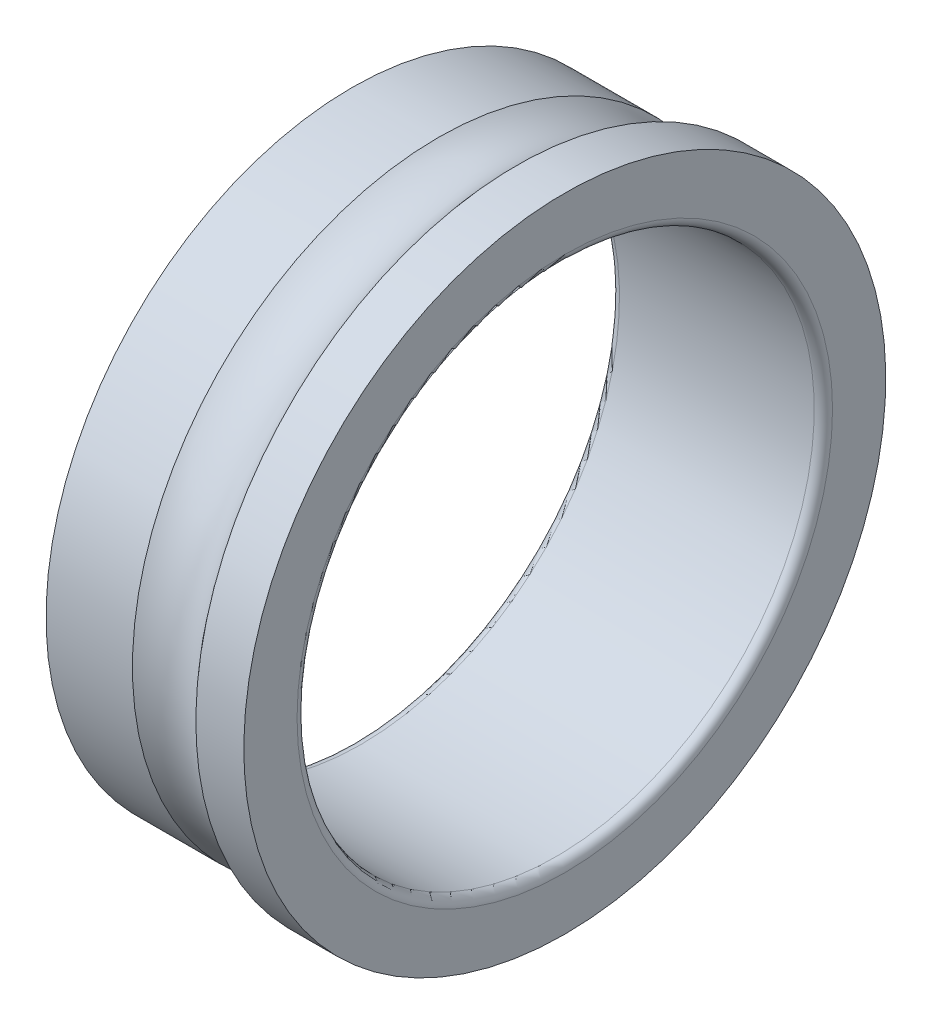
ISO-10303-21;
HEADER;
FILE_DESCRIPTION(('STEP AP214'),'2;1');
FILE_NAME('part.step','',(''),(''),'','','');
FILE_SCHEMA(('AUTOMOTIVE_DESIGN { 1 0 10303 214 1 1 1 1 }'));
ENDSEC;
DATA;
#1=APPLICATION_CONTEXT('core data for automotive mechanical design processes');
#2=APPLICATION_PROTOCOL_DEFINITION('international standard','automotive_design',2000,#1);
#3=PRODUCT_CONTEXT('',#1,'mechanical');
#4=PRODUCT('Part','Part','',(#3));
#5=PRODUCT_RELATED_PRODUCT_CATEGORY('part','',(#4));
#6=PRODUCT_DEFINITION_FORMATION('','',#4);
#7=PRODUCT_DEFINITION_CONTEXT('part definition',#1,'design');
#8=PRODUCT_DEFINITION('design','',#6,#7);
#9=PRODUCT_DEFINITION_SHAPE('','',#8);
#10=(LENGTH_UNIT() NAMED_UNIT(*) SI_UNIT(.MILLI.,.METRE.));
#11=(NAMED_UNIT(*) PLANE_ANGLE_UNIT() SI_UNIT($,.RADIAN.));
#12=(NAMED_UNIT(*) SI_UNIT($,.STERADIAN.) SOLID_ANGLE_UNIT());
#13=UNCERTAINTY_MEASURE_WITH_UNIT(LENGTH_MEASURE(1.E-05),#10,'distance_accuracy_value','');
#14=(GEOMETRIC_REPRESENTATION_CONTEXT(3) GLOBAL_UNCERTAINTY_ASSIGNED_CONTEXT((#13)) GLOBAL_UNIT_ASSIGNED_CONTEXT((#10,
#11,#12)) REPRESENTATION_CONTEXT('',''));
#15=CARTESIAN_POINT('',(0.,0.,0.));
#16=DIRECTION('',(0.,0.,1.));
#17=DIRECTION('',(1.,0.,0.));
#18=AXIS2_PLACEMENT_3D('',#15,#16,#17);
#19=CARTESIAN_POINT('',(0.,9.425,0.));
#20=DIRECTION('',(-1.,0.,0.));
#21=DIRECTION('',(0.,0.,1.));
#22=AXIS2_PLACEMENT_3D('',#19,#20,#21);
#23=PLANE('',#22);
#24=CARTESIAN_POINT('',(0.,0.,0.));
#25=DIRECTION('',(1.,0.,0.));
#26=DIRECTION('',(0.,1.,0.));
#27=AXIS2_PLACEMENT_3D('',#24,#25,#26);
#28=CIRCLE('',#27,8.8);
#29=CARTESIAN_POINT('',(0.,0.,8.8));
#30=VERTEX_POINT('',#29);
#31=EDGE_CURVE('E66',#30,#30,#28,.T.);
#32=ORIENTED_EDGE('',*,*,#31,.T.);
#33=EDGE_LOOP('',(#32));
#34=FACE_BOUND('',#33,.T.);
#35=CARTESIAN_POINT('',(0.,0.,0.));
#36=DIRECTION('',(1.,0.,0.));
#37=DIRECTION('',(0.,1.,0.));
#38=AXIS2_PLACEMENT_3D('',#35,#36,#37);
#39=CIRCLE('',#38,10.05);
#40=CARTESIAN_POINT('',(0.,-10.05,0.));
#41=VERTEX_POINT('',#40);
#42=EDGE_CURVE('E70',#41,#41,#39,.T.);
#43=ORIENTED_EDGE('',*,*,#42,.F.);
#44=EDGE_LOOP('',(#43));
#45=FACE_BOUND('',#44,.T.);
#46=ADVANCED_FACE('F17',(#34,#45),#23,.T.);
#47=CARTESIAN_POINT('',(7.,9.675,0.));
#48=DIRECTION('',(1.,0.,0.));
#49=DIRECTION('',(0.,1.,0.));
#50=AXIS2_PLACEMENT_3D('',#47,#48,#49);
#51=PLANE('',#50);
#52=CARTESIAN_POINT('',(7.,0.,0.));
#53=DIRECTION('',(1.,0.,0.));
#54=DIRECTION('',(0.,1.,0.));
#55=AXIS2_PLACEMENT_3D('',#52,#53,#54);
#56=CIRCLE('',#55,8.8);
#57=CARTESIAN_POINT('',(7.,0.,8.8));
#58=VERTEX_POINT('',#57);
#59=EDGE_CURVE('E11',#58,#58,#56,.T.);
#60=ORIENTED_EDGE('',*,*,#59,.F.);
#61=EDGE_LOOP('',(#60));
#62=FACE_BOUND('',#61,.T.);
#63=CARTESIAN_POINT('',(7.,0.,0.));
#64=DIRECTION('',(1.,0.,0.));
#65=DIRECTION('',(0.,1.,0.));
#66=AXIS2_PLACEMENT_3D('',#63,#64,#65);
#67=CIRCLE('',#66,10.55);
#68=CARTESIAN_POINT('',(7.,-10.55,0.));
#69=VERTEX_POINT('',#68);
#70=EDGE_CURVE('E77',#69,#69,#67,.T.);
#71=ORIENTED_EDGE('',*,*,#70,.T.);
#72=EDGE_LOOP('',(#71));
#73=FACE_BOUND('',#72,.T.);
#74=ADVANCED_FACE('F102',(#62,#73),#51,.T.);
#75=CARTESIAN_POINT('',(6.7,0.,0.));
#76=DIRECTION('',(1.,0.,0.));
#77=DIRECTION('',(0.,0.,-1.));
#78=AXIS2_PLACEMENT_3D('',#75,#76,#77);
#79=TOROIDAL_SURFACE('',#78,8.8,0.3);
#80=ORIENTED_EDGE('',*,*,#59,.T.);
#81=EDGE_LOOP('',(#80));
#82=FACE_BOUND('',#81,.T.);
#83=CARTESIAN_POINT('',(6.7,0.,0.));
#84=DIRECTION('',(1.,0.,0.));
#85=DIRECTION('',(0.,1.,0.));
#86=AXIS2_PLACEMENT_3D('',#83,#84,#85);
#87=CIRCLE('',#86,8.5);
#88=CARTESIAN_POINT('',(6.7,0.,8.5));
#89=VERTEX_POINT('',#88);
#90=EDGE_CURVE('E27',#89,#89,#87,.T.);
#91=ORIENTED_EDGE('',*,*,#90,.F.);
#92=EDGE_LOOP('',(#91));
#93=FACE_BOUND('',#92,.T.);
#94=ADVANCED_FACE('F107',(#82,#93),#79,.T.);
#95=CARTESIAN_POINT('',(3.5,0.,0.));
#96=DIRECTION('',(1.,0.,0.));
#97=DIRECTION('',(0.,1.,0.));
#98=AXIS2_PLACEMENT_3D('',#95,#96,#97);
#99=CYLINDRICAL_SURFACE('',#98,8.5);
#100=CARTESIAN_POINT('',(0.3,0.,0.));
#101=DIRECTION('',(1.,0.,0.));
#102=DIRECTION('',(0.,1.,0.));
#103=AXIS2_PLACEMENT_3D('',#100,#101,#102);
#104=CIRCLE('',#103,8.5);
#105=CARTESIAN_POINT('',(0.3,-8.5,0.));
#106=VERTEX_POINT('',#105);
#107=EDGE_CURVE('E21',#106,#106,#104,.T.);
#108=ORIENTED_EDGE('',*,*,#107,.F.);
#109=EDGE_LOOP('',(#108));
#110=FACE_BOUND('',#109,.T.);
#111=ORIENTED_EDGE('',*,*,#90,.T.);
#112=EDGE_LOOP('',(#111));
#113=FACE_BOUND('',#112,.T.);
#114=ADVANCED_FACE('F135',(#110,#113),#99,.F.);
#115=CARTESIAN_POINT('',(0.3,0.,0.));
#116=DIRECTION('',(1.,0.,0.));
#117=DIRECTION('',(0.,0.,-1.));
#118=AXIS2_PLACEMENT_3D('',#115,#116,#117);
#119=TOROIDAL_SURFACE('',#118,8.8,0.3);
#120=ORIENTED_EDGE('',*,*,#107,.T.);
#121=EDGE_LOOP('',(#120));
#122=FACE_BOUND('',#121,.T.);
#123=ORIENTED_EDGE('',*,*,#31,.F.);
#124=EDGE_LOOP('',(#123));
#125=FACE_BOUND('',#124,.T.);
#126=ADVANCED_FACE('F125',(#122,#125),#119,.T.);
#127=CARTESIAN_POINT('',(1.41986569300212,0.,0.));
#128=DIRECTION('',(1.,0.,0.));
#129=DIRECTION('',(0.,1.,0.));
#130=AXIS2_PLACEMENT_3D('',#127,#128,#129);
#131=CYLINDRICAL_SURFACE('',#130,10.05);
#132=ORIENTED_EDGE('',*,*,#42,.T.);
#133=EDGE_LOOP('',(#132));
#134=FACE_BOUND('',#133,.T.);
#135=CARTESIAN_POINT('',(2.83973138600425,0.,0.));
#136=DIRECTION('',(1.,0.,0.));
#137=DIRECTION('',(0.,1.,0.));
#138=AXIS2_PLACEMENT_3D('',#135,#136,#137);
#139=CIRCLE('',#138,10.05);
#140=CARTESIAN_POINT('',(2.83973138600425,10.05,0.));
#141=VERTEX_POINT('',#140);
#142=EDGE_CURVE('E81',#141,#141,#139,.T.);
#143=ORIENTED_EDGE('',*,*,#142,.F.);
#144=EDGE_LOOP('',(#143));
#145=FACE_BOUND('',#144,.T.);
#146=ADVANCED_FACE('F93',(#134,#145),#131,.T.);
#147=CARTESIAN_POINT('',(6.21170608768595,0.,0.));
#148=DIRECTION('',(1.,0.,0.));
#149=DIRECTION('',(0.,1.,0.));
#150=AXIS2_PLACEMENT_3D('',#147,#148,#149);
#151=CYLINDRICAL_SURFACE('',#150,10.55);
#152=CARTESIAN_POINT('',(5.4234121753719,0.,0.));
#153=DIRECTION('',(1.,0.,0.));
#154=DIRECTION('',(0.,1.,0.));
#155=AXIS2_PLACEMENT_3D('',#152,#153,#154);
#156=CIRCLE('',#155,10.55);
#157=CARTESIAN_POINT('',(5.4234121753719,-10.55,0.));
#158=VERTEX_POINT('',#157);
#159=EDGE_CURVE('E165',#158,#158,#156,.T.);
#160=ORIENTED_EDGE('',*,*,#159,.T.);
#161=EDGE_LOOP('',(#160));
#162=FACE_BOUND('',#161,.T.);
#163=ORIENTED_EDGE('',*,*,#70,.F.);
#164=EDGE_LOOP('',(#163));
#165=FACE_BOUND('',#164,.T.);
#166=ADVANCED_FACE('F88',(#162,#165),#151,.T.);
#167=CARTESIAN_POINT('',(3.84931942079864,0.,0.));
#168=DIRECTION('',(1.,0.,0.));
#169=DIRECTION('',(0.,0.,-1.));
#170=AXIS2_PLACEMENT_3D('',#167,#168,#169);
#171=TOROIDAL_SURFACE('',#170,11.7585,1.9845);
#172=ORIENTED_EDGE('',*,*,#159,.F.);
#173=EDGE_LOOP('',(#172));
#174=FACE_BOUND('',#173,.T.);
#175=ORIENTED_EDGE('',*,*,#142,.T.);
#176=EDGE_LOOP('',(#175));
#177=FACE_BOUND('',#176,.T.);
#178=ADVANCED_FACE('F19',(#174,#177),#171,.F.);
#179=CLOSED_SHELL('',(#46,#74,#94,#114,#126,#146,#166,#178));
#180=MANIFOLD_SOLID_BREP('B1',#179);
#181=ADVANCED_BREP_SHAPE_REPRESENTATION('',(#18,#180),#14);
#182=SHAPE_DEFINITION_REPRESENTATION(#9,#181);
ENDSEC;
END-ISO-10303-21;
